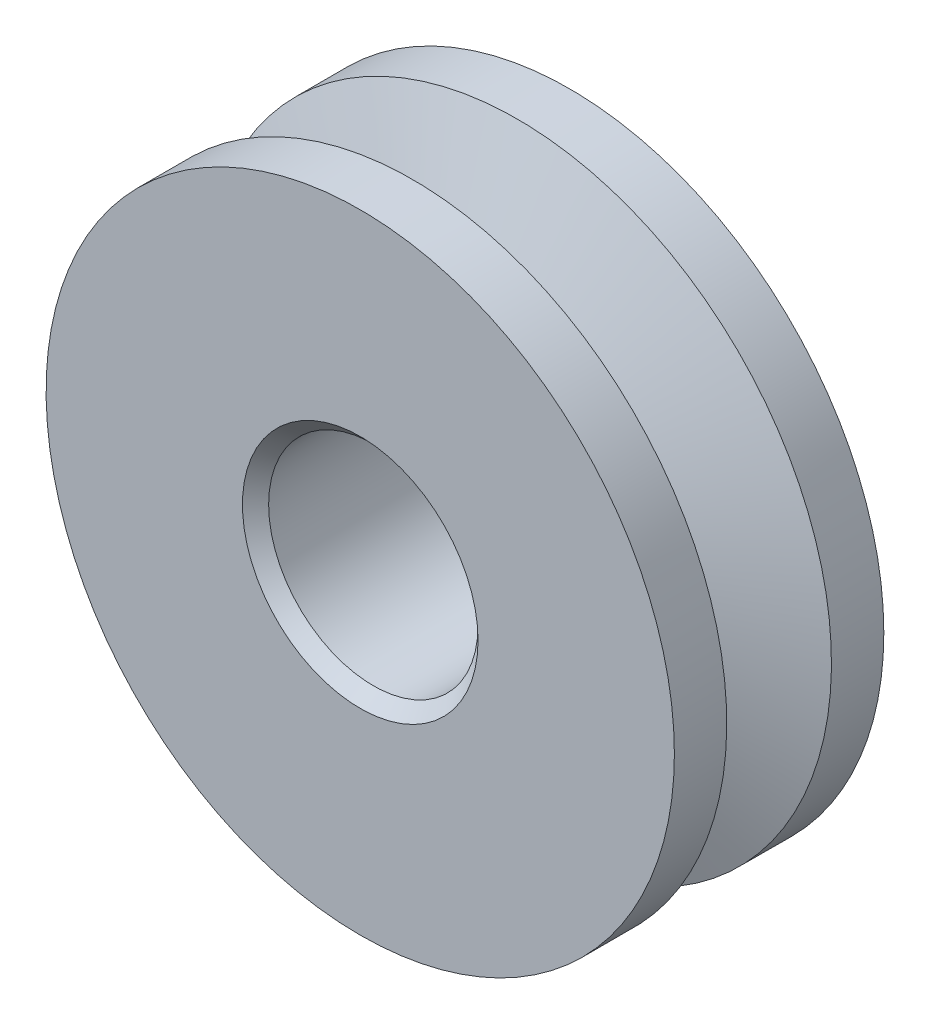
ISO-10303-21;
HEADER;
FILE_DESCRIPTION(('STEP AP214'),'2;1');
FILE_NAME('part.step','',(''),(''),'','','');
FILE_SCHEMA(('AUTOMOTIVE_DESIGN { 1 0 10303 214 1 1 1 1 }'));
ENDSEC;
DATA;
#1=APPLICATION_CONTEXT('core data for automotive mechanical design processes');
#2=APPLICATION_PROTOCOL_DEFINITION('international standard','automotive_design',2000,#1);
#3=PRODUCT_CONTEXT('',#1,'mechanical');
#4=PRODUCT('Part','Part','',(#3));
#5=PRODUCT_RELATED_PRODUCT_CATEGORY('part','',(#4));
#6=PRODUCT_DEFINITION_FORMATION('','',#4);
#7=PRODUCT_DEFINITION_CONTEXT('part definition',#1,'design');
#8=PRODUCT_DEFINITION('design','',#6,#7);
#9=PRODUCT_DEFINITION_SHAPE('','',#8);
#10=(LENGTH_UNIT() NAMED_UNIT(*) SI_UNIT(.MILLI.,.METRE.));
#11=(NAMED_UNIT(*) PLANE_ANGLE_UNIT() SI_UNIT($,.RADIAN.));
#12=(NAMED_UNIT(*) SI_UNIT($,.STERADIAN.) SOLID_ANGLE_UNIT());
#13=UNCERTAINTY_MEASURE_WITH_UNIT(LENGTH_MEASURE(1.E-05),#10,'distance_accuracy_value','');
#14=(GEOMETRIC_REPRESENTATION_CONTEXT(3) GLOBAL_UNCERTAINTY_ASSIGNED_CONTEXT((#13)) GLOBAL_UNIT_ASSIGNED_CONTEXT((#10,
#11,#12)) REPRESENTATION_CONTEXT('',''));
#15=CARTESIAN_POINT('',(0.,0.,0.));
#16=DIRECTION('',(0.,0.,1.));
#17=DIRECTION('',(1.,0.,0.));
#18=AXIS2_PLACEMENT_3D('',#15,#16,#17);
#19=CARTESIAN_POINT('',(0.,0.,6.35));
#20=DIRECTION('',(0.,0.,-1.));
#21=DIRECTION('',(-1.,0.,0.));
#22=AXIS2_PLACEMENT_3D('',#19,#20,#21);
#23=CYLINDRICAL_SURFACE('',#22,19.05);
#24=CARTESIAN_POINT('',(0.,0.,6.35));
#25=DIRECTION('',(0.,0.,1.));
#26=DIRECTION('',(1.,0.,0.));
#27=AXIS2_PLACEMENT_3D('',#24,#25,#26);
#28=CIRCLE('',#27,19.05);
#29=CARTESIAN_POINT('',(19.05,0.,6.35));
#30=VERTEX_POINT('',#29);
#31=EDGE_CURVE('E53',#30,#30,#28,.T.);
#32=ORIENTED_EDGE('',*,*,#31,.F.);
#33=EDGE_LOOP('',(#32));
#34=FACE_BOUND('',#33,.T.);
#35=CARTESIAN_POINT('',(0.,0.,3.17500000000002));
#36=DIRECTION('',(0.,0.,1.));
#37=DIRECTION('',(0.,-1.,0.));
#38=AXIS2_PLACEMENT_3D('',#35,#36,#37);
#39=CIRCLE('',#38,19.05);
#40=CARTESIAN_POINT('',(0.,-19.05,3.17500000000004));
#41=VERTEX_POINT('',#40);
#42=EDGE_CURVE('E57',#41,#41,#39,.T.);
#43=ORIENTED_EDGE('',*,*,#42,.T.);
#44=EDGE_LOOP('',(#43));
#45=FACE_BOUND('',#44,.T.);
#46=ADVANCED_FACE('F33',(#34,#45),#23,.T.);
#47=CARTESIAN_POINT('',(0.,0.,-6.35));
#48=DIRECTION('',(0.,0.,1.));
#49=DIRECTION('',(1.,0.,0.));
#50=AXIS2_PLACEMENT_3D('',#47,#48,#49);
#51=CIRCLE('',#50,19.05);
#52=CARTESIAN_POINT('',(19.05,0.,-6.35));
#53=VERTEX_POINT('',#52);
#54=EDGE_CURVE('E54',#53,#53,#51,.T.);
#55=ORIENTED_EDGE('',*,*,#54,.T.);
#56=EDGE_LOOP('',(#55));
#57=FACE_BOUND('',#56,.T.);
#58=CARTESIAN_POINT('',(0.,0.,-3.17499999999998));
#59=DIRECTION('',(0.,0.,1.));
#60=DIRECTION('',(0.,-1.,0.));
#61=AXIS2_PLACEMENT_3D('',#58,#59,#60);
#62=CIRCLE('',#61,19.05);
#63=CARTESIAN_POINT('',(0.,-19.05,-3.17499999999996));
#64=VERTEX_POINT('',#63);
#65=EDGE_CURVE('E62',#64,#64,#62,.T.);
#66=ORIENTED_EDGE('',*,*,#65,.F.);
#67=EDGE_LOOP('',(#66));
#68=FACE_BOUND('',#67,.T.);
#69=ADVANCED_FACE('F86',(#57,#68),#23,.T.);
#70=CARTESIAN_POINT('',(0.,0.,6.35));
#71=DIRECTION('',(0.,0.,1.));
#72=DIRECTION('',(1.,0.,0.));
#73=AXIS2_PLACEMENT_3D('',#70,#71,#72);
#74=PLANE('',#73);
#75=CARTESIAN_POINT('',(0.,0.,6.35));
#76=DIRECTION('',(0.,0.,1.));
#77=DIRECTION('',(1.,0.,0.));
#78=AXIS2_PLACEMENT_3D('',#75,#76,#77);
#79=CIRCLE('',#78,7.14375);
#80=CARTESIAN_POINT('',(7.14375,0.,6.35));
#81=VERTEX_POINT('',#80);
#82=EDGE_CURVE('E10',#81,#81,#79,.F.);
#83=ORIENTED_EDGE('',*,*,#82,.T.);
#84=EDGE_LOOP('',(#83));
#85=FACE_BOUND('',#84,.T.);
#86=ORIENTED_EDGE('',*,*,#31,.T.);
#87=EDGE_LOOP('',(#86));
#88=FACE_BOUND('',#87,.T.);
#89=ADVANCED_FACE('F92',(#85,#88),#74,.T.);
#90=CARTESIAN_POINT('',(0.,0.,-6.35));
#91=DIRECTION('',(0.,0.,1.));
#92=DIRECTION('',(1.,0.,0.));
#93=AXIS2_PLACEMENT_3D('',#90,#91,#92);
#94=PLANE('',#93);
#95=CARTESIAN_POINT('',(0.,0.,-6.35));
#96=DIRECTION('',(0.,0.,1.));
#97=DIRECTION('',(1.,0.,0.));
#98=AXIS2_PLACEMENT_3D('',#95,#96,#97);
#99=CIRCLE('',#98,7.14375);
#100=CARTESIAN_POINT('',(7.14375,0.,-6.35));
#101=VERTEX_POINT('',#100);
#102=EDGE_CURVE('E48',#101,#101,#99,.T.);
#103=ORIENTED_EDGE('',*,*,#102,.T.);
#104=EDGE_LOOP('',(#103));
#105=FACE_BOUND('',#104,.T.);
#106=ORIENTED_EDGE('',*,*,#54,.F.);
#107=EDGE_LOOP('',(#106));
#108=FACE_BOUND('',#107,.T.);
#109=ADVANCED_FACE('F97',(#105,#108),#94,.F.);
#110=CARTESIAN_POINT('',(0.,0.,6.35));
#111=DIRECTION('',(0.,0.,-1.));
#112=DIRECTION('',(-1.,0.,0.));
#113=AXIS2_PLACEMENT_3D('',#110,#111,#112);
#114=CYLINDRICAL_SURFACE('',#113,6.35);
#115=CARTESIAN_POINT('',(0.,0.,-5.55624999999999));
#116=DIRECTION('',(0.,0.,1.));
#117=DIRECTION('',(1.,0.,0.));
#118=AXIS2_PLACEMENT_3D('',#115,#116,#117);
#119=CIRCLE('',#118,6.35);
#120=CARTESIAN_POINT('',(6.35,0.,-5.55624999999999));
#121=VERTEX_POINT('',#120);
#122=EDGE_CURVE('E40',#121,#121,#119,.F.);
#123=ORIENTED_EDGE('',*,*,#122,.T.);
#124=EDGE_LOOP('',(#123));
#125=FACE_BOUND('',#124,.T.);
#126=CARTESIAN_POINT('',(0.,0.,5.55625));
#127=DIRECTION('',(0.,0.,1.));
#128=DIRECTION('',(1.,0.,0.));
#129=AXIS2_PLACEMENT_3D('',#126,#127,#128);
#130=CIRCLE('',#129,6.35);
#131=CARTESIAN_POINT('',(6.35,0.,5.55625));
#132=VERTEX_POINT('',#131);
#133=EDGE_CURVE('E44',#132,#132,#130,.T.);
#134=ORIENTED_EDGE('',*,*,#133,.T.);
#135=EDGE_LOOP('',(#134));
#136=FACE_BOUND('',#135,.T.);
#137=ADVANCED_FACE('F101',(#125,#136),#114,.F.);
#138=CARTESIAN_POINT('',(0.,0.,-6.35));
#139=DIRECTION('',(0.,0.,-1.));
#140=DIRECTION('',(-1.,0.,0.));
#141=AXIS2_PLACEMENT_3D('',#138,#139,#140);
#142=CONICAL_SURFACE('',#141,7.14375,0.785398163397447);
#143=ORIENTED_EDGE('',*,*,#122,.F.);
#144=EDGE_LOOP('',(#143));
#145=FACE_BOUND('',#144,.T.);
#146=ORIENTED_EDGE('',*,*,#102,.F.);
#147=EDGE_LOOP('',(#146));
#148=FACE_BOUND('',#147,.T.);
#149=ADVANCED_FACE('F99',(#145,#148),#142,.F.);
#150=CARTESIAN_POINT('',(0.,0.,5.55625));
#151=DIRECTION('',(0.,0.,1.));
#152=DIRECTION('',(1.,0.,0.));
#153=AXIS2_PLACEMENT_3D('',#150,#151,#152);
#154=CONICAL_SURFACE('',#153,6.35,0.785398163397449);
#155=CARTESIAN_POINT('',(7.14375,0.,6.35));
#156=CARTESIAN_POINT('',(7.13548177083334,0.,6.34173177083333));
#157=CARTESIAN_POINT('',(7.12721354166667,0.,6.33346354166667));
#158=CARTESIAN_POINT('',(7.11067708333334,0.,6.31692708333333));
#159=CARTESIAN_POINT('',(7.10240885416667,0.,6.30865885416667));
#160=CARTESIAN_POINT('',(7.08587239583334,0.,6.29212239583333));
#161=CARTESIAN_POINT('',(7.07760416666667,0.,6.28385416666667));
#162=CARTESIAN_POINT('',(7.06106770833334,0.,6.26731770833333));
#163=CARTESIAN_POINT('',(7.05279947916667,0.,6.25904947916667));
#164=CARTESIAN_POINT('',(7.03626302083334,0.,6.24251302083333));
#165=CARTESIAN_POINT('',(7.02799479166667,0.,6.23424479166667));
#166=CARTESIAN_POINT('',(7.01145833333334,0.,6.21770833333333));
#167=CARTESIAN_POINT('',(7.00319010416667,0.,6.20944010416667));
#168=CARTESIAN_POINT('',(6.98665364583334,0.,6.19290364583333));
#169=CARTESIAN_POINT('',(6.97838541666667,0.,6.18463541666667));
#170=CARTESIAN_POINT('',(6.96184895833334,0.,6.16809895833333));
#171=CARTESIAN_POINT('',(6.95358072916667,0.,6.15983072916667));
#172=CARTESIAN_POINT('',(6.93704427083334,0.,6.14329427083333));
#173=CARTESIAN_POINT('',(6.92877604166667,0.,6.13502604166666));
#174=CARTESIAN_POINT('',(6.91223958333333,0.,6.11848958333333));
#175=CARTESIAN_POINT('',(6.90397135416667,0.,6.11022135416667));
#176=CARTESIAN_POINT('',(6.88743489583334,0.,6.09368489583333));
#177=CARTESIAN_POINT('',(6.87916666666667,0.,6.08541666666667));
#178=CARTESIAN_POINT('',(6.86263020833334,0.,6.06888020833333));
#179=CARTESIAN_POINT('',(6.85436197916667,0.,6.06061197916666));
#180=CARTESIAN_POINT('',(6.83782552083334,0.,6.04407552083333));
#181=CARTESIAN_POINT('',(6.82955729166667,0.,6.03580729166666));
#182=CARTESIAN_POINT('',(6.81302083333333,0.,6.01927083333333));
#183=CARTESIAN_POINT('',(6.80475260416667,0.,6.01100260416667));
#184=CARTESIAN_POINT('',(6.78821614583333,0.,5.99446614583333));
#185=CARTESIAN_POINT('',(6.77994791666667,0.,5.98619791666667));
#186=CARTESIAN_POINT('',(6.76341145833333,0.,5.96966145833333));
#187=CARTESIAN_POINT('',(6.75514322916667,0.,5.96139322916666));
#188=CARTESIAN_POINT('',(6.73860677083333,0.,5.94485677083333));
#189=CARTESIAN_POINT('',(6.73033854166667,0.,5.93658854166666));
#190=CARTESIAN_POINT('',(6.71380208333333,0.,5.92005208333333));
#191=CARTESIAN_POINT('',(6.70553385416667,0.,5.91178385416667));
#192=CARTESIAN_POINT('',(6.68899739583333,0.,5.89524739583333));
#193=CARTESIAN_POINT('',(6.68072916666667,0.,5.88697916666666));
#194=CARTESIAN_POINT('',(6.66419270833333,0.,5.87044270833333));
#195=CARTESIAN_POINT('',(6.65592447916667,0.,5.86217447916666));
#196=CARTESIAN_POINT('',(6.63938802083333,0.,5.84563802083333));
#197=CARTESIAN_POINT('',(6.63111979166667,0.,5.83736979166666));
#198=CARTESIAN_POINT('',(6.61458333333333,0.,5.82083333333333));
#199=CARTESIAN_POINT('',(6.60631510416667,0.,5.81256510416666));
#200=CARTESIAN_POINT('',(6.58977864583333,0.,5.79602864583333));
#201=CARTESIAN_POINT('',(6.58151041666667,0.,5.78776041666666));
#202=CARTESIAN_POINT('',(6.56497395833333,0.,5.77122395833333));
#203=CARTESIAN_POINT('',(6.55670572916667,0.,5.76295572916666));
#204=CARTESIAN_POINT('',(6.54016927083333,0.,5.74641927083333));
#205=CARTESIAN_POINT('',(6.53190104166667,0.,5.73815104166666));
#206=CARTESIAN_POINT('',(6.51536458333333,0.,5.72161458333333));
#207=CARTESIAN_POINT('',(6.50709635416667,0.,5.71334635416666));
#208=CARTESIAN_POINT('',(6.49055989583333,0.,5.69680989583333));
#209=CARTESIAN_POINT('',(6.48229166666667,0.,5.68854166666666));
#210=CARTESIAN_POINT('',(6.46575520833333,0.,5.67200520833333));
#211=CARTESIAN_POINT('',(6.45748697916667,0.,5.66373697916666));
#212=CARTESIAN_POINT('',(6.44095052083333,0.,5.64720052083333));
#213=CARTESIAN_POINT('',(6.43268229166667,0.,5.63893229166666));
#214=CARTESIAN_POINT('',(6.41614583333333,0.,5.62239583333333));
#215=CARTESIAN_POINT('',(6.40787760416667,0.,5.61412760416666));
#216=CARTESIAN_POINT('',(6.39134114583333,0.,5.59759114583333));
#217=CARTESIAN_POINT('',(6.38307291666667,0.,5.58932291666666));
#218=CARTESIAN_POINT('',(6.36653645833333,0.,5.57278645833333));
#219=CARTESIAN_POINT('',(6.35826822916667,0.,5.56451822916666));
#220=CARTESIAN_POINT('',(6.35,0.,5.55625));
#221=B_SPLINE_CURVE_WITH_KNOTS('',3,(#155,#156,#157,#158,#159,#160,#161,#162,#163,#164,#165,
#166,#167,#168,#169,#170,#171,#172,#173,#174,#175,#176,#177,#178,#179,#180,#181,#182,#183,#184,
#185,#186,#187,#188,#189,#190,#191,#192,#193,#194,#195,#196,#197,#198,#199,#200,#201,#202,#203,
#204,#205,#206,#207,#208,#209,#210,#211,#212,#213,#214,#215,#216,#217,#218,#219,#220),
.UNSPECIFIED.,.F.,.F.,(4,2,2,2,2,2,2,2,2,2,2,2,2,2,2,2,2,2,2,2,2,2,2,2,2,2,2,2,2,2,2,2,4),(0.,
0.0350791254729262,0.070158250945853,0.10523737641878,0.140316501891707,0.175395627364632,
0.210474752837559,0.245553878310486,0.280633003783413,0.315712129256339,0.350791254729266,
0.385870380202192,0.420949505675119,0.456028631148045,0.491107756620972,0.526186882093898,
0.561266007566825,0.596345133039751,0.631424258512677,0.666503383985604,0.701582509458531,
0.736661634931457,0.771740760404384,0.80681988587731,0.841899011350237,0.876978136823163,
0.91205726229609,0.947136387769016,0.982215513241943,1.01729463871487,1.0523737641878,
1.08745288966072,1.12253201513365),.UNSPECIFIED.);
#222=EDGE_CURVE('BSEAM35',#81,#132,#221,.T.);
#223=ORIENTED_EDGE('',*,*,#82,.F.);
#224=ORIENTED_EDGE('',*,*,#133,.F.);
#225=ORIENTED_EDGE('',*,*,#222,.T.);
#226=ORIENTED_EDGE('',*,*,#222,.F.);
#227=EDGE_LOOP('',(#223,#225,#224,#226));
#228=FACE_BOUND('',#227,.T.);
#229=ADVANCED_FACE('F35',(#228),#154,.F.);
#230=CARTESIAN_POINT('',(0.,0.,3.17500000000002));
#231=DIRECTION('',(0.,0.,1.));
#232=DIRECTION('',(0.,-1.,0.));
#233=AXIS2_PLACEMENT_3D('',#230,#231,#232);
#234=CONICAL_SURFACE('',#233,19.05,1.22173047639603);
#235=CARTESIAN_POINT('',(0.,0.,0.863789012409648));
#236=DIRECTION('',(0.,0.,1.));
#237=DIRECTION('',(0.,-1.,0.));
#238=AXIS2_PLACEMENT_3D('',#235,#236,#237);
#239=CIRCLE('',#238,12.7);
#240=CARTESIAN_POINT('',(0.,-12.7,0.863789012409662));
#241=VERTEX_POINT('',#240);
#242=EDGE_CURVE('E68',#241,#241,#239,.T.);
#243=ORIENTED_EDGE('',*,*,#242,.T.);
#244=EDGE_LOOP('',(#243));
#245=FACE_BOUND('',#244,.T.);
#246=ORIENTED_EDGE('',*,*,#42,.F.);
#247=EDGE_LOOP('',(#246));
#248=FACE_BOUND('',#247,.T.);
#249=ADVANCED_FACE('F72',(#245,#248),#234,.T.);
#250=CARTESIAN_POINT('',(0.,0.,-0.86378901240962));
#251=DIRECTION('',(0.,0.,-1.));
#252=DIRECTION('',(0.,1.,0.));
#253=AXIS2_PLACEMENT_3D('',#250,#251,#252);
#254=CONICAL_SURFACE('',#253,12.7,1.22173047639603);
#255=ORIENTED_EDGE('',*,*,#65,.T.);
#256=EDGE_LOOP('',(#255));
#257=FACE_BOUND('',#256,.T.);
#258=CARTESIAN_POINT('',(0.,0.,-0.86378901240962));
#259=DIRECTION('',(0.,0.,1.));
#260=DIRECTION('',(0.,-1.,0.));
#261=AXIS2_PLACEMENT_3D('',#258,#259,#260);
#262=CIRCLE('',#261,12.7);
#263=CARTESIAN_POINT('',(0.,-12.7,-0.863789012409607));
#264=VERTEX_POINT('',#263);
#265=EDGE_CURVE('E65',#264,#264,#262,.T.);
#266=ORIENTED_EDGE('',*,*,#265,.F.);
#267=EDGE_LOOP('',(#266));
#268=FACE_BOUND('',#267,.T.);
#269=ADVANCED_FACE('F77',(#257,#268),#254,.T.);
#270=CARTESIAN_POINT('',(0.,0.,6.35));
#271=DIRECTION('',(0.,0.,1.));
#272=DIRECTION('',(0.,-1.,0.));
#273=AXIS2_PLACEMENT_3D('',#270,#271,#272);
#274=CYLINDRICAL_SURFACE('',#273,12.7);
#275=ORIENTED_EDGE('',*,*,#265,.T.);
#276=EDGE_LOOP('',(#275));
#277=FACE_BOUND('',#276,.T.);
#278=ORIENTED_EDGE('',*,*,#242,.F.);
#279=EDGE_LOOP('',(#278));
#280=FACE_BOUND('',#279,.T.);
#281=ADVANCED_FACE('F75',(#277,#280),#274,.T.);
#282=CLOSED_SHELL('',(#46,#69,#89,#109,#137,#149,#229,#249,#269,#281));
#283=MANIFOLD_SOLID_BREP('B2',#282);
#284=ADVANCED_BREP_SHAPE_REPRESENTATION('',(#18,#283),#14);
#285=SHAPE_DEFINITION_REPRESENTATION(#9,#284);
ENDSEC;
END-ISO-10303-21;
